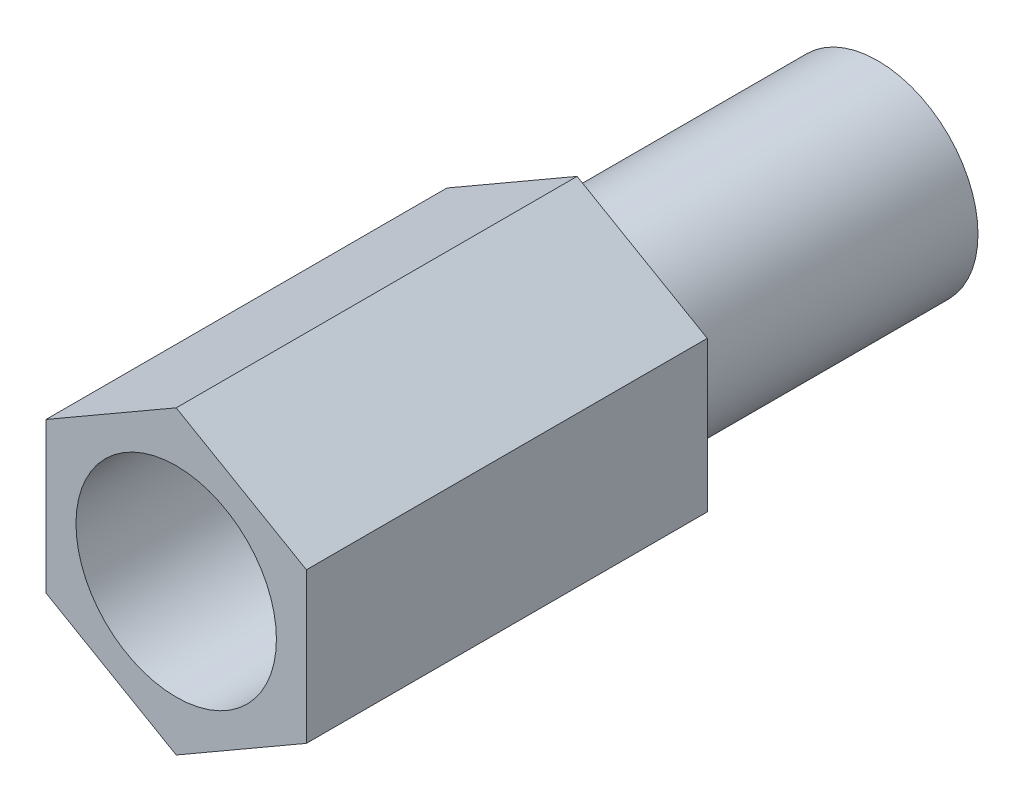
ISO-10303-21;
HEADER;
FILE_DESCRIPTION(('STEP AP214'),'2;1');
FILE_NAME('part.step','',(''),(''),'','','');
FILE_SCHEMA(('AUTOMOTIVE_DESIGN { 1 0 10303 214 1 1 1 1 }'));
ENDSEC;
DATA;
#1=APPLICATION_CONTEXT('core data for automotive mechanical design processes');
#2=APPLICATION_PROTOCOL_DEFINITION('international standard','automotive_design',2000,#1);
#3=PRODUCT_CONTEXT('',#1,'mechanical');
#4=PRODUCT('Part','Part','',(#3));
#5=PRODUCT_RELATED_PRODUCT_CATEGORY('part','',(#4));
#6=PRODUCT_DEFINITION_FORMATION('','',#4);
#7=PRODUCT_DEFINITION_CONTEXT('part definition',#1,'design');
#8=PRODUCT_DEFINITION('design','',#6,#7);
#9=PRODUCT_DEFINITION_SHAPE('','',#8);
#10=(LENGTH_UNIT() NAMED_UNIT(*) SI_UNIT(.MILLI.,.METRE.));
#11=(NAMED_UNIT(*) PLANE_ANGLE_UNIT() SI_UNIT($,.RADIAN.));
#12=(NAMED_UNIT(*) SI_UNIT($,.STERADIAN.) SOLID_ANGLE_UNIT());
#13=UNCERTAINTY_MEASURE_WITH_UNIT(LENGTH_MEASURE(1.E-05),#10,'distance_accuracy_value','');
#14=(GEOMETRIC_REPRESENTATION_CONTEXT(3) GLOBAL_UNCERTAINTY_ASSIGNED_CONTEXT((#13)) GLOBAL_UNIT_ASSIGNED_CONTEXT((#10,
#11,#12)) REPRESENTATION_CONTEXT('',''));
#15=CARTESIAN_POINT('',(0.,0.,0.));
#16=DIRECTION('',(0.,0.,1.));
#17=DIRECTION('',(1.,0.,0.));
#18=AXIS2_PLACEMENT_3D('',#15,#16,#17);
#19=CARTESIAN_POINT('',(2.5980762113533,1.50000000000003,8.));
#20=DIRECTION('',(-0.499999999999995,-0.866025403784442,0.));
#21=DIRECTION('',(0.866025403784442,-0.499999999999995,0.));
#22=AXIS2_PLACEMENT_3D('',#19,#20,#21);
#23=PLANE('',#22);
#24=DIRECTION('',(-0.866025403784442,0.499999999999995,0.));
#25=VECTOR('',#24,1.);
#26=CARTESIAN_POINT('',(2.5980762113533,1.50000000000003,0.));
#27=LINE('',#26,#25);
#28=CARTESIAN_POINT('',(2.5980762113533,1.50000000000003,0.));
#29=VERTEX_POINT('',#28);
#30=CARTESIAN_POINT('',(0.,3.,0.));
#31=VERTEX_POINT('',#30);
#32=EDGE_CURVE('E123',#29,#31,#27,.T.);
#33=ORIENTED_EDGE('',*,*,#32,.T.);
#34=DIRECTION('',(0.,0.,-1.));
#35=VECTOR('',#34,1.);
#36=CARTESIAN_POINT('',(0.,3.,8.));
#37=LINE('',#36,#35);
#38=CARTESIAN_POINT('',(0.,3.,8.));
#39=VERTEX_POINT('',#38);
#40=EDGE_CURVE('E40',#39,#31,#37,.T.);
#41=ORIENTED_EDGE('',*,*,#40,.F.);
#42=DIRECTION('',(-0.866025403784442,0.499999999999995,0.));
#43=VECTOR('',#42,1.);
#44=CARTESIAN_POINT('',(2.5980762113533,1.50000000000003,8.));
#45=LINE('',#44,#43);
#46=CARTESIAN_POINT('',(2.5980762113533,1.50000000000003,8.));
#47=VERTEX_POINT('',#46);
#48=EDGE_CURVE('E134',#47,#39,#45,.T.);
#49=ORIENTED_EDGE('',*,*,#48,.F.);
#50=DIRECTION('',(0.,0.,-1.));
#51=VECTOR('',#50,1.);
#52=CARTESIAN_POINT('',(2.5980762113533,1.50000000000003,8.));
#53=LINE('',#52,#51);
#54=EDGE_CURVE('E119',#47,#29,#53,.T.);
#55=ORIENTED_EDGE('',*,*,#54,.T.);
#56=EDGE_LOOP('',(#33,#41,#49,#55));
#57=FACE_BOUND('',#56,.T.);
#58=ADVANCED_FACE('F37',(#57),#23,.F.);
#59=CARTESIAN_POINT('',(0.,3.,8.));
#60=DIRECTION('',(0.500000000000001,-0.866025403784438,0.));
#61=DIRECTION('',(0.866025403784438,0.500000000000001,0.));
#62=AXIS2_PLACEMENT_3D('',#59,#60,#61);
#63=PLANE('',#62);
#64=DIRECTION('',(-0.866025403784438,-0.500000000000001,0.));
#65=VECTOR('',#64,1.);
#66=CARTESIAN_POINT('',(0.,3.,0.));
#67=LINE('',#66,#65);
#68=CARTESIAN_POINT('',(-2.59807621135332,1.49999999999999,0.));
#69=VERTEX_POINT('',#68);
#70=EDGE_CURVE('E126',#31,#69,#67,.T.);
#71=ORIENTED_EDGE('',*,*,#70,.T.);
#72=DIRECTION('',(0.,0.,-1.));
#73=VECTOR('',#72,1.);
#74=CARTESIAN_POINT('',(-2.59807621135332,1.49999999999999,8.));
#75=LINE('',#74,#73);
#76=CARTESIAN_POINT('',(-2.59807621135332,1.49999999999999,8.));
#77=VERTEX_POINT('',#76);
#78=EDGE_CURVE('E137',#77,#69,#75,.T.);
#79=ORIENTED_EDGE('',*,*,#78,.F.);
#80=DIRECTION('',(-0.866025403784438,-0.500000000000001,0.));
#81=VECTOR('',#80,1.);
#82=CARTESIAN_POINT('',(0.,3.,8.));
#83=LINE('',#82,#81);
#84=EDGE_CURVE('E92',#39,#77,#83,.T.);
#85=ORIENTED_EDGE('',*,*,#84,.F.);
#86=ORIENTED_EDGE('',*,*,#40,.T.);
#87=EDGE_LOOP('',(#71,#79,#85,#86));
#88=FACE_BOUND('',#87,.T.);
#89=ADVANCED_FACE('F142',(#88),#63,.F.);
#90=CARTESIAN_POINT('',(-2.59807621135332,1.49999999999999,8.));
#91=DIRECTION('',(1.,0.,0.));
#92=DIRECTION('',(0.,1.,0.));
#93=AXIS2_PLACEMENT_3D('',#90,#91,#92);
#94=PLANE('',#93);
#95=DIRECTION('',(0.,-1.,0.));
#96=VECTOR('',#95,1.);
#97=CARTESIAN_POINT('',(-2.59807621135332,1.49999999999999,0.));
#98=LINE('',#97,#96);
#99=CARTESIAN_POINT('',(-2.59807621135331,-1.50000000000001,0.));
#100=VERTEX_POINT('',#99);
#101=EDGE_CURVE('E129',#69,#100,#98,.T.);
#102=ORIENTED_EDGE('',*,*,#101,.T.);
#103=DIRECTION('',(0.,0.,-1.));
#104=VECTOR('',#103,1.);
#105=CARTESIAN_POINT('',(-2.59807621135331,-1.50000000000001,8.));
#106=LINE('',#105,#104);
#107=CARTESIAN_POINT('',(-2.59807621135331,-1.50000000000001,8.));
#108=VERTEX_POINT('',#107);
#109=EDGE_CURVE('E114',#108,#100,#106,.T.);
#110=ORIENTED_EDGE('',*,*,#109,.F.);
#111=DIRECTION('',(0.,-1.,0.));
#112=VECTOR('',#111,1.);
#113=CARTESIAN_POINT('',(-2.59807621135332,1.49999999999999,8.));
#114=LINE('',#113,#112);
#115=EDGE_CURVE('E105',#77,#108,#114,.T.);
#116=ORIENTED_EDGE('',*,*,#115,.F.);
#117=ORIENTED_EDGE('',*,*,#78,.T.);
#118=EDGE_LOOP('',(#102,#110,#116,#117));
#119=FACE_BOUND('',#118,.T.);
#120=ADVANCED_FACE('F148',(#119),#94,.F.);
#121=CARTESIAN_POINT('',(-2.59807621135331,-1.50000000000001,8.));
#122=DIRECTION('',(0.499999999999995,0.866025403784442,0.));
#123=DIRECTION('',(-0.866025403784442,0.499999999999995,0.));
#124=AXIS2_PLACEMENT_3D('',#121,#122,#123);
#125=PLANE('',#124);
#126=DIRECTION('',(0.866025403784442,-0.499999999999995,0.));
#127=VECTOR('',#126,1.);
#128=CARTESIAN_POINT('',(-2.59807621135331,-1.50000000000001,0.));
#129=LINE('',#128,#127);
#130=CARTESIAN_POINT('',(0.,-3.,0.));
#131=VERTEX_POINT('',#130);
#132=EDGE_CURVE('E113',#100,#131,#129,.T.);
#133=ORIENTED_EDGE('',*,*,#132,.T.);
#134=DIRECTION('',(0.,0.,-1.));
#135=VECTOR('',#134,1.);
#136=CARTESIAN_POINT('',(0.,-3.,8.));
#137=LINE('',#136,#135);
#138=CARTESIAN_POINT('',(0.,-3.,8.));
#139=VERTEX_POINT('',#138);
#140=EDGE_CURVE('E110',#139,#131,#137,.T.);
#141=ORIENTED_EDGE('',*,*,#140,.F.);
#142=DIRECTION('',(0.866025403784442,-0.499999999999995,0.));
#143=VECTOR('',#142,1.);
#144=CARTESIAN_POINT('',(-2.59807621135331,-1.50000000000001,8.));
#145=LINE('',#144,#143);
#146=EDGE_CURVE('E99',#108,#139,#145,.T.);
#147=ORIENTED_EDGE('',*,*,#146,.F.);
#148=ORIENTED_EDGE('',*,*,#109,.T.);
#149=EDGE_LOOP('',(#133,#141,#147,#148));
#150=FACE_BOUND('',#149,.T.);
#151=ADVANCED_FACE('F111',(#150),#125,.F.);
#152=CARTESIAN_POINT('',(0.,-3.,8.));
#153=DIRECTION('',(-0.500000000000007,0.866025403784435,0.));
#154=DIRECTION('',(-0.866025403784435,-0.500000000000007,0.));
#155=AXIS2_PLACEMENT_3D('',#152,#153,#154);
#156=PLANE('',#155);
#157=DIRECTION('',(0.866025403784435,0.500000000000007,0.));
#158=VECTOR('',#157,1.);
#159=CARTESIAN_POINT('',(0.,-3.,0.));
#160=LINE('',#159,#158);
#161=CARTESIAN_POINT('',(2.59807621135333,-1.49999999999998,0.));
#162=VERTEX_POINT('',#161);
#163=EDGE_CURVE('E77',#131,#162,#160,.T.);
#164=ORIENTED_EDGE('',*,*,#163,.T.);
#165=DIRECTION('',(0.,0.,-1.));
#166=VECTOR('',#165,1.);
#167=CARTESIAN_POINT('',(2.59807621135333,-1.49999999999998,8.));
#168=LINE('',#167,#166);
#169=CARTESIAN_POINT('',(2.59807621135333,-1.49999999999998,8.));
#170=VERTEX_POINT('',#169);
#171=EDGE_CURVE('E115',#170,#162,#168,.T.);
#172=ORIENTED_EDGE('',*,*,#171,.F.);
#173=DIRECTION('',(0.866025403784435,0.500000000000007,0.));
#174=VECTOR('',#173,1.);
#175=CARTESIAN_POINT('',(0.,-3.,8.));
#176=LINE('',#175,#174);
#177=EDGE_CURVE('E103',#139,#170,#176,.T.);
#178=ORIENTED_EDGE('',*,*,#177,.F.);
#179=ORIENTED_EDGE('',*,*,#140,.T.);
#180=EDGE_LOOP('',(#164,#172,#178,#179));
#181=FACE_BOUND('',#180,.T.);
#182=ADVANCED_FACE('F117',(#181),#156,.F.);
#183=CARTESIAN_POINT('',(2.59807621135333,-1.49999999999998,8.));
#184=DIRECTION('',(-1.,0.,0.));
#185=DIRECTION('',(0.,-1.,0.));
#186=AXIS2_PLACEMENT_3D('',#183,#184,#185);
#187=PLANE('',#186);
#188=DIRECTION('',(0.,1.,0.));
#189=VECTOR('',#188,1.);
#190=CARTESIAN_POINT('',(2.59807621135333,-1.49999999999998,0.));
#191=LINE('',#190,#189);
#192=EDGE_CURVE('E83',#162,#29,#191,.T.);
#193=ORIENTED_EDGE('',*,*,#192,.T.);
#194=ORIENTED_EDGE('',*,*,#54,.F.);
#195=DIRECTION('',(0.,1.,0.));
#196=VECTOR('',#195,1.);
#197=CARTESIAN_POINT('',(2.59807621135333,-1.49999999999998,8.));
#198=LINE('',#197,#196);
#199=EDGE_CURVE('E54',#170,#47,#198,.T.);
#200=ORIENTED_EDGE('',*,*,#199,.F.);
#201=ORIENTED_EDGE('',*,*,#171,.T.);
#202=EDGE_LOOP('',(#193,#194,#200,#201));
#203=FACE_BOUND('',#202,.T.);
#204=ADVANCED_FACE('F180',(#203),#187,.F.);
#205=CARTESIAN_POINT('',(0.,0.,8.));
#206=DIRECTION('',(0.,0.,1.));
#207=DIRECTION('',(1.,0.,0.));
#208=AXIS2_PLACEMENT_3D('',#205,#206,#207);
#209=PLANE('',#208);
#210=CARTESIAN_POINT('',(0.,0.,8.));
#211=DIRECTION('',(0.,0.,1.));
#212=DIRECTION('',(1.,0.,0.));
#213=AXIS2_PLACEMENT_3D('',#210,#211,#212);
#214=CIRCLE('',#213,2.);
#215=CARTESIAN_POINT('',(2.,0.,8.));
#216=VERTEX_POINT('',#215);
#217=EDGE_CURVE('E152',#216,#216,#214,.T.);
#218=ORIENTED_EDGE('',*,*,#217,.F.);
#219=EDGE_LOOP('',(#218));
#220=FACE_BOUND('',#219,.T.);
#221=ORIENTED_EDGE('',*,*,#48,.T.);
#222=ORIENTED_EDGE('',*,*,#84,.T.);
#223=ORIENTED_EDGE('',*,*,#115,.T.);
#224=ORIENTED_EDGE('',*,*,#146,.T.);
#225=ORIENTED_EDGE('',*,*,#177,.T.);
#226=ORIENTED_EDGE('',*,*,#199,.T.);
#227=EDGE_LOOP('',(#221,#222,#223,#224,#225,#226));
#228=FACE_BOUND('',#227,.T.);
#229=ADVANCED_FACE('F101',(#220,#228),#209,.T.);
#230=CARTESIAN_POINT('',(0.,0.,0.));
#231=DIRECTION('',(0.,0.,1.));
#232=DIRECTION('',(1.,0.,0.));
#233=AXIS2_PLACEMENT_3D('',#230,#231,#232);
#234=PLANE('',#233);
#235=CARTESIAN_POINT('',(0.,0.,0.));
#236=DIRECTION('',(0.,0.,-1.));
#237=DIRECTION('',(-1.,0.,0.));
#238=AXIS2_PLACEMENT_3D('',#235,#236,#237);
#239=CIRCLE('',#238,2.);
#240=CARTESIAN_POINT('',(-2.,0.,0.));
#241=VERTEX_POINT('',#240);
#242=EDGE_CURVE('E11',#241,#241,#239,.T.);
#243=ORIENTED_EDGE('',*,*,#242,.F.);
#244=EDGE_LOOP('',(#243));
#245=FACE_BOUND('',#244,.T.);
#246=ORIENTED_EDGE('',*,*,#32,.F.);
#247=ORIENTED_EDGE('',*,*,#192,.F.);
#248=ORIENTED_EDGE('',*,*,#163,.F.);
#249=ORIENTED_EDGE('',*,*,#132,.F.);
#250=ORIENTED_EDGE('',*,*,#101,.F.);
#251=ORIENTED_EDGE('',*,*,#70,.F.);
#252=EDGE_LOOP('',(#246,#247,#248,#249,#250,#251));
#253=FACE_BOUND('',#252,.T.);
#254=ADVANCED_FACE('F147',(#245,#253),#234,.F.);
#255=CARTESIAN_POINT('',(0.,0.,2.));
#256=DIRECTION('',(0.,0.,1.));
#257=DIRECTION('',(1.,0.,0.));
#258=AXIS2_PLACEMENT_3D('',#255,#256,#257);
#259=CYLINDRICAL_SURFACE('',#258,2.);
#260=CARTESIAN_POINT('',(0.,0.,2.));
#261=DIRECTION('',(0.,0.,1.));
#262=DIRECTION('',(1.,0.,0.));
#263=AXIS2_PLACEMENT_3D('',#260,#261,#262);
#264=CIRCLE('',#263,2.);
#265=CARTESIAN_POINT('',(2.,0.,2.));
#266=VERTEX_POINT('',#265);
#267=EDGE_CURVE('E127',#266,#266,#264,.T.);
#268=ORIENTED_EDGE('',*,*,#267,.F.);
#269=EDGE_LOOP('',(#268));
#270=FACE_BOUND('',#269,.T.);
#271=ORIENTED_EDGE('',*,*,#217,.T.);
#272=EDGE_LOOP('',(#271));
#273=FACE_BOUND('',#272,.T.);
#274=ADVANCED_FACE('F171',(#270,#273),#259,.F.);
#275=CARTESIAN_POINT('',(0.,0.,2.));
#276=DIRECTION('',(0.,0.,1.));
#277=DIRECTION('',(1.,0.,0.));
#278=AXIS2_PLACEMENT_3D('',#275,#276,#277);
#279=PLANE('',#278);
#280=ORIENTED_EDGE('',*,*,#267,.T.);
#281=EDGE_LOOP('',(#280));
#282=FACE_BOUND('',#281,.T.);
#283=ADVANCED_FACE('F166',(#282),#279,.T.);
#284=CARTESIAN_POINT('',(0.,0.,-6.));
#285=DIRECTION('',(0.,0.,1.));
#286=DIRECTION('',(1.,0.,0.));
#287=AXIS2_PLACEMENT_3D('',#284,#285,#286);
#288=CYLINDRICAL_SURFACE('',#287,2.);
#289=CARTESIAN_POINT('',(0.,0.,-6.));
#290=DIRECTION('',(0.,0.,-1.));
#291=DIRECTION('',(-1.,0.,0.));
#292=AXIS2_PLACEMENT_3D('',#289,#290,#291);
#293=CIRCLE('',#292,2.);
#294=CARTESIAN_POINT('',(-2.,0.,-6.));
#295=VERTEX_POINT('',#294);
#296=EDGE_CURVE('E155',#295,#295,#293,.T.);
#297=ORIENTED_EDGE('',*,*,#296,.F.);
#298=EDGE_LOOP('',(#297));
#299=FACE_BOUND('',#298,.T.);
#300=ORIENTED_EDGE('',*,*,#242,.T.);
#301=EDGE_LOOP('',(#300));
#302=FACE_BOUND('',#301,.T.);
#303=ADVANCED_FACE('F163',(#299,#302),#288,.T.);
#304=CARTESIAN_POINT('',(0.,0.,-6.));
#305=DIRECTION('',(0.,0.,-1.));
#306=DIRECTION('',(-1.,0.,0.));
#307=AXIS2_PLACEMENT_3D('',#304,#305,#306);
#308=PLANE('',#307);
#309=ORIENTED_EDGE('',*,*,#296,.T.);
#310=EDGE_LOOP('',(#309));
#311=FACE_BOUND('',#310,.T.);
#312=ADVANCED_FACE('F161',(#311),#308,.T.);
#313=CLOSED_SHELL('',(#58,#89,#120,#151,#182,#204,#229,#254,#274,#283,#303,#312));
#314=MANIFOLD_SOLID_BREP('B2',#313);
#315=ADVANCED_BREP_SHAPE_REPRESENTATION('',(#18,#314),#14);
#316=SHAPE_DEFINITION_REPRESENTATION(#9,#315);
ENDSEC;
END-ISO-10303-21;
